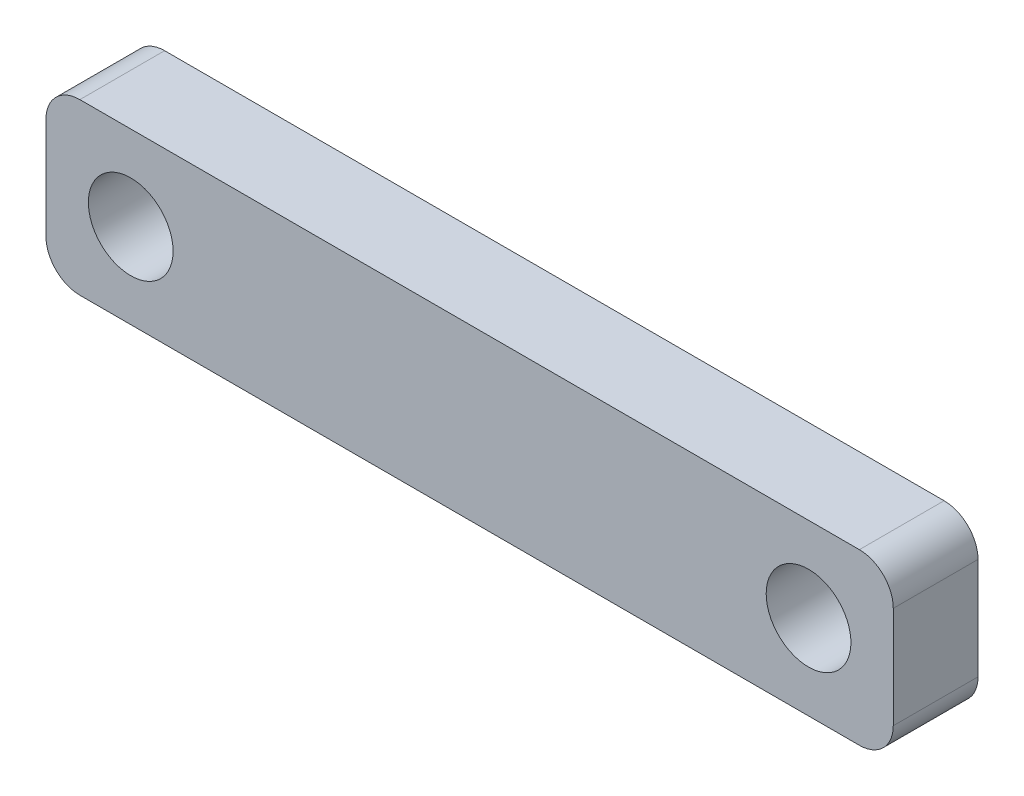
ISO-10303-21;
HEADER;
FILE_DESCRIPTION(('STEP AP214'),'2;1');
FILE_NAME('part.step','',(''),(''),'','','');
FILE_SCHEMA(('AUTOMOTIVE_DESIGN { 1 0 10303 214 1 1 1 1 }'));
ENDSEC;
DATA;
#1=APPLICATION_CONTEXT('core data for automotive mechanical design processes');
#2=APPLICATION_PROTOCOL_DEFINITION('international standard','automotive_design',2000,#1);
#3=PRODUCT_CONTEXT('',#1,'mechanical');
#4=PRODUCT('Part','Part','',(#3));
#5=PRODUCT_RELATED_PRODUCT_CATEGORY('part','',(#4));
#6=PRODUCT_DEFINITION_FORMATION('','',#4);
#7=PRODUCT_DEFINITION_CONTEXT('part definition',#1,'design');
#8=PRODUCT_DEFINITION('design','',#6,#7);
#9=PRODUCT_DEFINITION_SHAPE('','',#8);
#10=(LENGTH_UNIT() NAMED_UNIT(*) SI_UNIT(.MILLI.,.METRE.));
#11=(NAMED_UNIT(*) PLANE_ANGLE_UNIT() SI_UNIT($,.RADIAN.));
#12=(NAMED_UNIT(*) SI_UNIT($,.STERADIAN.) SOLID_ANGLE_UNIT());
#13=UNCERTAINTY_MEASURE_WITH_UNIT(LENGTH_MEASURE(1.E-05),#10,'distance_accuracy_value','');
#14=(GEOMETRIC_REPRESENTATION_CONTEXT(3) GLOBAL_UNCERTAINTY_ASSIGNED_CONTEXT((#13)) GLOBAL_UNIT_ASSIGNED_CONTEXT((#10,
#11,#12)) REPRESENTATION_CONTEXT('',''));
#15=CARTESIAN_POINT('',(0.,0.,0.));
#16=DIRECTION('',(0.,0.,1.));
#17=DIRECTION('',(1.,0.,0.));
#18=AXIS2_PLACEMENT_3D('',#15,#16,#17);
#19=CARTESIAN_POINT('',(0.,0.,5.));
#20=DIRECTION('',(0.,0.,1.));
#21=DIRECTION('',(1.,0.,0.));
#22=AXIS2_PLACEMENT_3D('',#19,#20,#21);
#23=PLANE('',#22);
#24=CARTESIAN_POINT('',(-11.3415861513688,3.36956521739131,5.));
#25=DIRECTION('',(0.,0.,1.));
#26=DIRECTION('',(1.,0.,0.));
#27=AXIS2_PLACEMENT_3D('',#24,#25,#26);
#28=CIRCLE('',#27,2.5);
#29=CARTESIAN_POINT('',(-8.84158615136876,3.36956521739131,5.));
#30=VERTEX_POINT('',#29);
#31=EDGE_CURVE('E125',#30,#30,#28,.T.);
#32=ORIENTED_EDGE('',*,*,#31,.F.);
#33=EDGE_LOOP('',(#32));
#34=FACE_BOUND('',#33,.T.);
#35=DIRECTION('',(1.,0.,0.));
#36=VECTOR('',#35,1.);
#37=CARTESIAN_POINT('',(-16.3415861513688,-1.63043478260869,5.));
#38=LINE('',#37,#36);
#39=CARTESIAN_POINT('',(-14.3415861513688,-1.63043478260869,5.));
#40=VERTEX_POINT('',#39);
#41=CARTESIAN_POINT('',(31.6584138486312,-1.63043478260869,5.));
#42=VERTEX_POINT('',#41);
#43=EDGE_CURVE('E180',#40,#42,#38,.T.);
#44=ORIENTED_EDGE('',*,*,#43,.T.);
#45=CARTESIAN_POINT('',(31.6584138486312,0.369565217391312,5.));
#46=DIRECTION('',(0.,0.,1.));
#47=DIRECTION('',(1.,0.,0.));
#48=AXIS2_PLACEMENT_3D('',#45,#46,#47);
#49=CIRCLE('',#48,2.);
#50=CARTESIAN_POINT('',(33.6584138486312,0.369565217391312,5.));
#51=VERTEX_POINT('',#50);
#52=EDGE_CURVE('E11',#42,#51,#49,.T.);
#53=ORIENTED_EDGE('',*,*,#52,.T.);
#54=DIRECTION('',(0.,1.,0.));
#55=VECTOR('',#54,1.);
#56=CARTESIAN_POINT('',(33.6584138486312,8.36956521739131,5.));
#57=LINE('',#56,#55);
#58=CARTESIAN_POINT('',(33.6584138486312,6.36956521739131,5.));
#59=VERTEX_POINT('',#58);
#60=EDGE_CURVE('E167',#51,#59,#57,.T.);
#61=ORIENTED_EDGE('',*,*,#60,.T.);
#62=CARTESIAN_POINT('',(31.6584138486312,6.36956521739131,5.));
#63=DIRECTION('',(0.,0.,1.));
#64=DIRECTION('',(1.,0.,0.));
#65=AXIS2_PLACEMENT_3D('',#62,#63,#64);
#66=CIRCLE('',#65,2.);
#67=CARTESIAN_POINT('',(31.6584138486312,8.36956521739131,5.));
#68=VERTEX_POINT('',#67);
#69=EDGE_CURVE('E158',#59,#68,#66,.T.);
#70=ORIENTED_EDGE('',*,*,#69,.T.);
#71=DIRECTION('',(-1.,0.,0.));
#72=VECTOR('',#71,1.);
#73=CARTESIAN_POINT('',(-16.3415861513688,8.36956521739131,5.));
#74=LINE('',#73,#72);
#75=CARTESIAN_POINT('',(-14.3415861513688,8.36956521739131,5.));
#76=VERTEX_POINT('',#75);
#77=EDGE_CURVE('E119',#68,#76,#74,.T.);
#78=ORIENTED_EDGE('',*,*,#77,.T.);
#79=CARTESIAN_POINT('',(-14.3415861513688,6.36956521739131,5.));
#80=DIRECTION('',(0.,0.,1.));
#81=DIRECTION('',(1.,0.,0.));
#82=AXIS2_PLACEMENT_3D('',#79,#80,#81);
#83=CIRCLE('',#82,2.);
#84=CARTESIAN_POINT('',(-16.3415861513688,6.36956521739131,5.));
#85=VERTEX_POINT('',#84);
#86=EDGE_CURVE('E139',#76,#85,#83,.T.);
#87=ORIENTED_EDGE('',*,*,#86,.T.);
#88=DIRECTION('',(0.,-1.,0.));
#89=VECTOR('',#88,1.);
#90=CARTESIAN_POINT('',(-16.3415861513688,8.36956521739131,5.));
#91=LINE('',#90,#89);
#92=CARTESIAN_POINT('',(-16.3415861513688,0.369565217391312,5.));
#93=VERTEX_POINT('',#92);
#94=EDGE_CURVE('E118',#85,#93,#91,.T.);
#95=ORIENTED_EDGE('',*,*,#94,.T.);
#96=CARTESIAN_POINT('',(-14.3415861513688,0.369565217391312,5.));
#97=DIRECTION('',(0.,0.,1.));
#98=DIRECTION('',(1.,0.,0.));
#99=AXIS2_PLACEMENT_3D('',#96,#97,#98);
#100=CIRCLE('',#99,2.);
#101=EDGE_CURVE('E147',#93,#40,#100,.T.);
#102=ORIENTED_EDGE('',*,*,#101,.T.);
#103=EDGE_LOOP('',(#44,#53,#61,#70,#78,#87,#95,#102));
#104=FACE_BOUND('',#103,.T.);
#105=CARTESIAN_POINT('',(28.6584138486312,3.36956521739131,5.));
#106=DIRECTION('',(0.,0.,1.));
#107=DIRECTION('',(-1.,0.,0.));
#108=AXIS2_PLACEMENT_3D('',#105,#106,#107);
#109=CIRCLE('',#108,2.5);
#110=CARTESIAN_POINT('',(26.1584138486312,3.36956521739131,5.));
#111=VERTEX_POINT('',#110);
#112=EDGE_CURVE('E185',#111,#111,#109,.T.);
#113=ORIENTED_EDGE('',*,*,#112,.F.);
#114=EDGE_LOOP('',(#113));
#115=FACE_BOUND('',#114,.T.);
#116=ADVANCED_FACE('F35',(#34,#104,#115),#23,.T.);
#117=CARTESIAN_POINT('',(0.,0.,0.));
#118=DIRECTION('',(0.,0.,1.));
#119=DIRECTION('',(1.,0.,0.));
#120=AXIS2_PLACEMENT_3D('',#117,#118,#119);
#121=PLANE('',#120);
#122=DIRECTION('',(0.,1.,0.));
#123=VECTOR('',#122,1.);
#124=CARTESIAN_POINT('',(33.6584138486312,8.36956521739131,0.));
#125=LINE('',#124,#123);
#126=CARTESIAN_POINT('',(33.6584138486312,0.369565217391312,0.));
#127=VERTEX_POINT('',#126);
#128=CARTESIAN_POINT('',(33.6584138486312,6.36956521739131,0.));
#129=VERTEX_POINT('',#128);
#130=EDGE_CURVE('E127',#127,#129,#125,.T.);
#131=ORIENTED_EDGE('',*,*,#130,.F.);
#132=CARTESIAN_POINT('',(31.6584138486312,0.369565217391312,0.));
#133=DIRECTION('',(0.,0.,1.));
#134=DIRECTION('',(1.,0.,0.));
#135=AXIS2_PLACEMENT_3D('',#132,#133,#134);
#136=CIRCLE('',#135,2.);
#137=CARTESIAN_POINT('',(31.6584138486312,-1.63043478260869,0.));
#138=VERTEX_POINT('',#137);
#139=EDGE_CURVE('E57',#127,#138,#136,.F.);
#140=ORIENTED_EDGE('',*,*,#139,.T.);
#141=DIRECTION('',(1.,0.,0.));
#142=VECTOR('',#141,1.);
#143=CARTESIAN_POINT('',(-16.3415861513688,-1.63043478260869,0.));
#144=LINE('',#143,#142);
#145=CARTESIAN_POINT('',(-14.3415861513688,-1.63043478260869,0.));
#146=VERTEX_POINT('',#145);
#147=EDGE_CURVE('E124',#146,#138,#144,.T.);
#148=ORIENTED_EDGE('',*,*,#147,.F.);
#149=CARTESIAN_POINT('',(-14.3415861513688,0.369565217391312,0.));
#150=DIRECTION('',(0.,0.,1.));
#151=DIRECTION('',(1.,0.,0.));
#152=AXIS2_PLACEMENT_3D('',#149,#150,#151);
#153=CIRCLE('',#152,2.);
#154=CARTESIAN_POINT('',(-16.3415861513688,0.369565217391312,0.));
#155=VERTEX_POINT('',#154);
#156=EDGE_CURVE('E123',#146,#155,#153,.F.);
#157=ORIENTED_EDGE('',*,*,#156,.T.);
#158=DIRECTION('',(0.,-1.,0.));
#159=VECTOR('',#158,1.);
#160=CARTESIAN_POINT('',(-16.3415861513688,8.36956521739131,0.));
#161=LINE('',#160,#159);
#162=CARTESIAN_POINT('',(-16.3415861513688,6.36956521739131,0.));
#163=VERTEX_POINT('',#162);
#164=EDGE_CURVE('E115',#163,#155,#161,.T.);
#165=ORIENTED_EDGE('',*,*,#164,.F.);
#166=CARTESIAN_POINT('',(-14.3415861513688,6.36956521739131,0.));
#167=DIRECTION('',(0.,0.,1.));
#168=DIRECTION('',(1.,0.,0.));
#169=AXIS2_PLACEMENT_3D('',#166,#167,#168);
#170=CIRCLE('',#169,2.);
#171=CARTESIAN_POINT('',(-14.3415861513688,8.36956521739131,0.));
#172=VERTEX_POINT('',#171);
#173=EDGE_CURVE('E101',#163,#172,#170,.F.);
#174=ORIENTED_EDGE('',*,*,#173,.T.);
#175=DIRECTION('',(-1.,0.,0.));
#176=VECTOR('',#175,1.);
#177=CARTESIAN_POINT('',(-16.3415861513688,8.36956521739131,0.));
#178=LINE('',#177,#176);
#179=CARTESIAN_POINT('',(31.6584138486312,8.36956521739131,0.));
#180=VERTEX_POINT('',#179);
#181=EDGE_CURVE('E136',#180,#172,#178,.T.);
#182=ORIENTED_EDGE('',*,*,#181,.F.);
#183=CARTESIAN_POINT('',(31.6584138486312,6.36956521739131,0.));
#184=DIRECTION('',(0.,0.,1.));
#185=DIRECTION('',(1.,0.,0.));
#186=AXIS2_PLACEMENT_3D('',#183,#184,#185);
#187=CIRCLE('',#186,2.);
#188=EDGE_CURVE('E152',#180,#129,#187,.F.);
#189=ORIENTED_EDGE('',*,*,#188,.T.);
#190=EDGE_LOOP('',(#131,#140,#148,#157,#165,#174,#182,#189));
#191=FACE_BOUND('',#190,.T.);
#192=CARTESIAN_POINT('',(-11.3415861513688,3.36956521739131,0.));
#193=DIRECTION('',(0.,0.,1.));
#194=DIRECTION('',(1.,0.,0.));
#195=AXIS2_PLACEMENT_3D('',#192,#193,#194);
#196=CIRCLE('',#195,2.5);
#197=CARTESIAN_POINT('',(-8.84158615136876,3.36956521739131,0.));
#198=VERTEX_POINT('',#197);
#199=EDGE_CURVE('E130',#198,#198,#196,.T.);
#200=ORIENTED_EDGE('',*,*,#199,.T.);
#201=EDGE_LOOP('',(#200));
#202=FACE_BOUND('',#201,.T.);
#203=CARTESIAN_POINT('',(28.6584138486312,3.36956521739131,0.));
#204=DIRECTION('',(0.,0.,1.));
#205=DIRECTION('',(-1.,0.,0.));
#206=AXIS2_PLACEMENT_3D('',#203,#204,#205);
#207=CIRCLE('',#206,2.5);
#208=CARTESIAN_POINT('',(26.1584138486312,3.36956521739131,0.));
#209=VERTEX_POINT('',#208);
#210=EDGE_CURVE('E187',#209,#209,#207,.T.);
#211=ORIENTED_EDGE('',*,*,#210,.T.);
#212=EDGE_LOOP('',(#211));
#213=FACE_BOUND('',#212,.T.);
#214=ADVANCED_FACE('F121',(#191,#202,#213),#121,.F.);
#215=CARTESIAN_POINT('',(-16.3415861513688,8.36956521739131,5.));
#216=DIRECTION('',(1.,0.,0.));
#217=DIRECTION('',(0.,1.,0.));
#218=AXIS2_PLACEMENT_3D('',#215,#216,#217);
#219=PLANE('',#218);
#220=ORIENTED_EDGE('',*,*,#164,.T.);
#221=DIRECTION('',(0.,0.,-1.));
#222=VECTOR('',#221,1.);
#223=CARTESIAN_POINT('',(-16.3415861513688,0.369565217391312,5.));
#224=LINE('',#223,#222);
#225=EDGE_CURVE('E145',#155,#93,#224,.F.);
#226=ORIENTED_EDGE('',*,*,#225,.T.);
#227=ORIENTED_EDGE('',*,*,#94,.F.);
#228=DIRECTION('',(0.,0.,-1.));
#229=VECTOR('',#228,1.);
#230=CARTESIAN_POINT('',(-16.3415861513688,6.36956521739131,5.));
#231=LINE('',#230,#229);
#232=EDGE_CURVE('E105',#85,#163,#231,.T.);
#233=ORIENTED_EDGE('',*,*,#232,.T.);
#234=EDGE_LOOP('',(#220,#226,#227,#233));
#235=FACE_BOUND('',#234,.T.);
#236=ADVANCED_FACE('F114',(#235),#219,.F.);
#237=CARTESIAN_POINT('',(-16.3415861513688,-1.63043478260869,5.));
#238=DIRECTION('',(0.,1.,0.));
#239=DIRECTION('',(0.,0.,1.));
#240=AXIS2_PLACEMENT_3D('',#237,#238,#239);
#241=PLANE('',#240);
#242=ORIENTED_EDGE('',*,*,#147,.T.);
#243=DIRECTION('',(0.,0.,-1.));
#244=VECTOR('',#243,1.);
#245=CARTESIAN_POINT('',(31.6584138486312,-1.63043478260869,5.));
#246=LINE('',#245,#244);
#247=EDGE_CURVE('E43',#138,#42,#246,.F.);
#248=ORIENTED_EDGE('',*,*,#247,.T.);
#249=ORIENTED_EDGE('',*,*,#43,.F.);
#250=DIRECTION('',(0.,0.,-1.));
#251=VECTOR('',#250,1.);
#252=CARTESIAN_POINT('',(-14.3415861513688,-1.63043478260869,5.));
#253=LINE('',#252,#251);
#254=EDGE_CURVE('E141',#40,#146,#253,.T.);
#255=ORIENTED_EDGE('',*,*,#254,.T.);
#256=EDGE_LOOP('',(#242,#248,#249,#255));
#257=FACE_BOUND('',#256,.T.);
#258=ADVANCED_FACE('F211',(#257),#241,.F.);
#259=CARTESIAN_POINT('',(33.6584138486312,8.36956521739131,5.));
#260=DIRECTION('',(-1.,0.,0.));
#261=DIRECTION('',(0.,0.,1.));
#262=AXIS2_PLACEMENT_3D('',#259,#260,#261);
#263=PLANE('',#262);
#264=ORIENTED_EDGE('',*,*,#60,.F.);
#265=DIRECTION('',(0.,0.,-1.));
#266=VECTOR('',#265,1.);
#267=CARTESIAN_POINT('',(33.6584138486312,0.369565217391312,5.));
#268=LINE('',#267,#266);
#269=EDGE_CURVE('E160',#51,#127,#268,.T.);
#270=ORIENTED_EDGE('',*,*,#269,.T.);
#271=ORIENTED_EDGE('',*,*,#130,.T.);
#272=DIRECTION('',(0.,0.,-1.));
#273=VECTOR('',#272,1.);
#274=CARTESIAN_POINT('',(33.6584138486312,6.36956521739131,5.));
#275=LINE('',#274,#273);
#276=EDGE_CURVE('E155',#129,#59,#275,.F.);
#277=ORIENTED_EDGE('',*,*,#276,.T.);
#278=EDGE_LOOP('',(#264,#270,#271,#277));
#279=FACE_BOUND('',#278,.T.);
#280=ADVANCED_FACE('F166',(#279),#263,.F.);
#281=CARTESIAN_POINT('',(-16.3415861513688,8.36956521739131,5.));
#282=DIRECTION('',(0.,-1.,0.));
#283=DIRECTION('',(0.,0.,-1.));
#284=AXIS2_PLACEMENT_3D('',#281,#282,#283);
#285=PLANE('',#284);
#286=ORIENTED_EDGE('',*,*,#77,.F.);
#287=DIRECTION('',(0.,0.,-1.));
#288=VECTOR('',#287,1.);
#289=CARTESIAN_POINT('',(31.6584138486312,8.36956521739131,5.));
#290=LINE('',#289,#288);
#291=EDGE_CURVE('E149',#68,#180,#290,.T.);
#292=ORIENTED_EDGE('',*,*,#291,.T.);
#293=ORIENTED_EDGE('',*,*,#181,.T.);
#294=DIRECTION('',(0.,0.,-1.));
#295=VECTOR('',#294,1.);
#296=CARTESIAN_POINT('',(-14.3415861513688,8.36956521739131,5.));
#297=LINE('',#296,#295);
#298=EDGE_CURVE('E107',#172,#76,#297,.F.);
#299=ORIENTED_EDGE('',*,*,#298,.T.);
#300=EDGE_LOOP('',(#286,#292,#293,#299));
#301=FACE_BOUND('',#300,.T.);
#302=ADVANCED_FACE('F179',(#301),#285,.F.);
#303=CARTESIAN_POINT('',(-11.3415861513688,3.36956521739131,5.));
#304=DIRECTION('',(0.,0.,-1.));
#305=DIRECTION('',(-1.,0.,0.));
#306=AXIS2_PLACEMENT_3D('',#303,#304,#305);
#307=CYLINDRICAL_SURFACE('',#306,2.5);
#308=ORIENTED_EDGE('',*,*,#31,.T.);
#309=EDGE_LOOP('',(#308));
#310=FACE_BOUND('',#309,.T.);
#311=ORIENTED_EDGE('',*,*,#199,.F.);
#312=EDGE_LOOP('',(#311));
#313=FACE_BOUND('',#312,.T.);
#314=ADVANCED_FACE('F204',(#310,#313),#307,.F.);
#315=CARTESIAN_POINT('',(28.6584138486312,3.36956521739131,5.));
#316=DIRECTION('',(0.,0.,-1.));
#317=DIRECTION('',(-1.,0.,0.));
#318=AXIS2_PLACEMENT_3D('',#315,#316,#317);
#319=CYLINDRICAL_SURFACE('',#318,2.5);
#320=ORIENTED_EDGE('',*,*,#112,.T.);
#321=EDGE_LOOP('',(#320));
#322=FACE_BOUND('',#321,.T.);
#323=ORIENTED_EDGE('',*,*,#210,.F.);
#324=EDGE_LOOP('',(#323));
#325=FACE_BOUND('',#324,.T.);
#326=ADVANCED_FACE('F193',(#322,#325),#319,.F.);
#327=CARTESIAN_POINT('',(-14.3415861513688,6.36956521739131,5.));
#328=DIRECTION('',(0.,0.,-1.));
#329=DIRECTION('',(-1.,0.,0.));
#330=AXIS2_PLACEMENT_3D('',#327,#328,#329);
#331=CYLINDRICAL_SURFACE('',#330,2.);
#332=ORIENTED_EDGE('',*,*,#86,.F.);
#333=ORIENTED_EDGE('',*,*,#298,.F.);
#334=ORIENTED_EDGE('',*,*,#173,.F.);
#335=ORIENTED_EDGE('',*,*,#232,.F.);
#336=EDGE_LOOP('',(#332,#333,#334,#335));
#337=FACE_BOUND('',#336,.T.);
#338=ADVANCED_FACE('F104',(#337),#331,.T.);
#339=CARTESIAN_POINT('',(-14.3415861513688,0.369565217391312,5.));
#340=DIRECTION('',(0.,0.,-1.));
#341=DIRECTION('',(-1.,0.,0.));
#342=AXIS2_PLACEMENT_3D('',#339,#340,#341);
#343=CYLINDRICAL_SURFACE('',#342,2.);
#344=ORIENTED_EDGE('',*,*,#101,.F.);
#345=ORIENTED_EDGE('',*,*,#225,.F.);
#346=ORIENTED_EDGE('',*,*,#156,.F.);
#347=ORIENTED_EDGE('',*,*,#254,.F.);
#348=EDGE_LOOP('',(#344,#345,#346,#347));
#349=FACE_BOUND('',#348,.T.);
#350=ADVANCED_FACE('F218',(#349),#343,.T.);
#351=CARTESIAN_POINT('',(31.6584138486312,6.36956521739131,5.));
#352=DIRECTION('',(0.,0.,-1.));
#353=DIRECTION('',(-1.,0.,0.));
#354=AXIS2_PLACEMENT_3D('',#351,#352,#353);
#355=CYLINDRICAL_SURFACE('',#354,2.);
#356=ORIENTED_EDGE('',*,*,#69,.F.);
#357=ORIENTED_EDGE('',*,*,#276,.F.);
#358=ORIENTED_EDGE('',*,*,#188,.F.);
#359=ORIENTED_EDGE('',*,*,#291,.F.);
#360=EDGE_LOOP('',(#356,#357,#358,#359));
#361=FACE_BOUND('',#360,.T.);
#362=ADVANCED_FACE('F174',(#361),#355,.T.);
#363=CARTESIAN_POINT('',(31.6584138486312,0.369565217391312,5.));
#364=DIRECTION('',(0.,0.,-1.));
#365=DIRECTION('',(-1.,0.,0.));
#366=AXIS2_PLACEMENT_3D('',#363,#364,#365);
#367=CYLINDRICAL_SURFACE('',#366,2.);
#368=ORIENTED_EDGE('',*,*,#52,.F.);
#369=ORIENTED_EDGE('',*,*,#247,.F.);
#370=ORIENTED_EDGE('',*,*,#139,.F.);
#371=ORIENTED_EDGE('',*,*,#269,.F.);
#372=EDGE_LOOP('',(#368,#369,#370,#371));
#373=FACE_BOUND('',#372,.T.);
#374=ADVANCED_FACE('F37',(#373),#367,.T.);
#375=CLOSED_SHELL('',(#116,#214,#236,#258,#280,#302,#314,#326,#338,#350,#362,#374));
#376=MANIFOLD_SOLID_BREP('B2',#375);
#377=ADVANCED_BREP_SHAPE_REPRESENTATION('',(#18,#376),#14);
#378=SHAPE_DEFINITION_REPRESENTATION(#9,#377);
ENDSEC;
END-ISO-10303-21;
